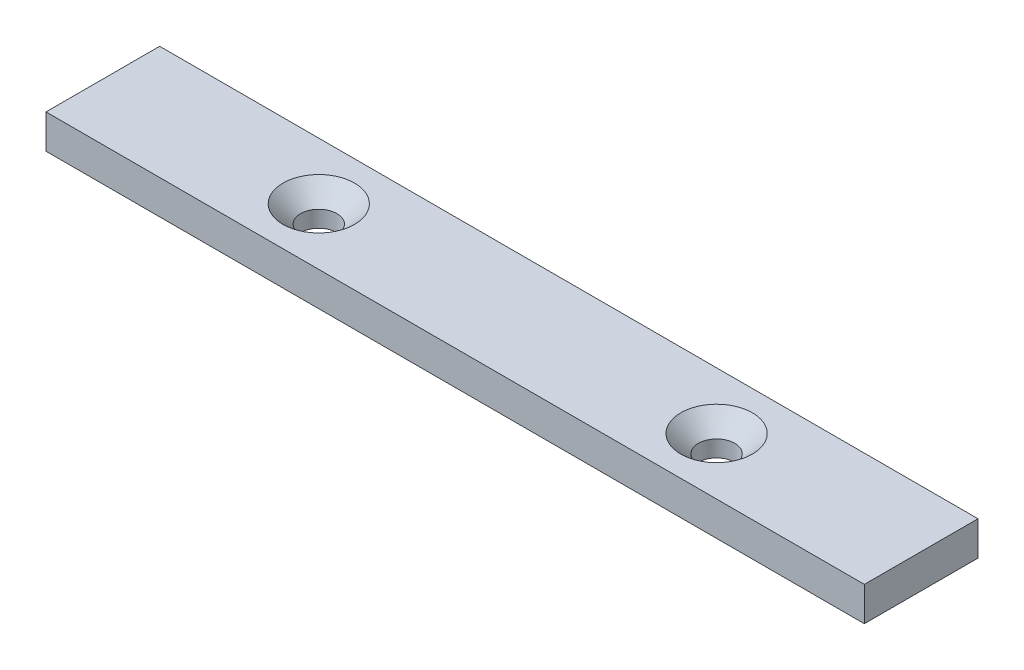
ISO-10303-21;
HEADER;
FILE_DESCRIPTION(('STEP AP214'),'2;1');
FILE_NAME('part.step','',(''),(''),'','','');
FILE_SCHEMA(('AUTOMOTIVE_DESIGN { 1 0 10303 214 1 1 1 1 }'));
ENDSEC;
DATA;
#1=APPLICATION_CONTEXT('core data for automotive mechanical design processes');
#2=APPLICATION_PROTOCOL_DEFINITION('international standard','automotive_design',2000,#1);
#3=PRODUCT_CONTEXT('',#1,'mechanical');
#4=PRODUCT('Part','Part','',(#3));
#5=PRODUCT_RELATED_PRODUCT_CATEGORY('part','',(#4));
#6=PRODUCT_DEFINITION_FORMATION('','',#4);
#7=PRODUCT_DEFINITION_CONTEXT('part definition',#1,'design');
#8=PRODUCT_DEFINITION('design','',#6,#7);
#9=PRODUCT_DEFINITION_SHAPE('','',#8);
#10=(LENGTH_UNIT() NAMED_UNIT(*) SI_UNIT(.MILLI.,.METRE.));
#11=(NAMED_UNIT(*) PLANE_ANGLE_UNIT() SI_UNIT($,.RADIAN.));
#12=(NAMED_UNIT(*) SI_UNIT($,.STERADIAN.) SOLID_ANGLE_UNIT());
#13=UNCERTAINTY_MEASURE_WITH_UNIT(LENGTH_MEASURE(1.E-05),#10,'distance_accuracy_value','');
#14=(GEOMETRIC_REPRESENTATION_CONTEXT(3) GLOBAL_UNCERTAINTY_ASSIGNED_CONTEXT((#13)) GLOBAL_UNIT_ASSIGNED_CONTEXT((#10,
#11,#12)) REPRESENTATION_CONTEXT('',''));
#15=CARTESIAN_POINT('',(0.,0.,0.));
#16=DIRECTION('',(0.,0.,1.));
#17=DIRECTION('',(1.,0.,0.));
#18=AXIS2_PLACEMENT_3D('',#15,#16,#17);
#19=CARTESIAN_POINT('',(0.,6.,0.));
#20=DIRECTION('',(0.,-1.,0.));
#21=DIRECTION('',(0.,0.,-1.));
#22=AXIS2_PLACEMENT_3D('',#19,#20,#21);
#23=PLANE('',#22);
#24=CARTESIAN_POINT('',(36.,6.,0.));
#25=DIRECTION('',(0.,1.,0.));
#26=DIRECTION('',(0.,0.,1.));
#27=AXIS2_PLACEMENT_3D('',#24,#25,#26);
#28=CIRCLE('',#27,6.3);
#29=CARTESIAN_POINT('',(36.,6.,6.3));
#30=VERTEX_POINT('',#29);
#31=EDGE_CURVE('E129',#30,#30,#28,.T.);
#32=ORIENTED_EDGE('',*,*,#31,.F.);
#33=EDGE_LOOP('',(#32));
#34=FACE_BOUND('',#33,.T.);
#35=DIRECTION('',(0.,0.,-1.));
#36=VECTOR('',#35,1.);
#37=CARTESIAN_POINT('',(72.,6.,10.));
#38=LINE('',#37,#36);
#39=CARTESIAN_POINT('',(72.,6.,10.));
#40=VERTEX_POINT('',#39);
#41=CARTESIAN_POINT('',(72.,6.,-10.));
#42=VERTEX_POINT('',#41);
#43=EDGE_CURVE('E89',#40,#42,#38,.T.);
#44=ORIENTED_EDGE('',*,*,#43,.T.);
#45=DIRECTION('',(-1.,0.,0.));
#46=VECTOR('',#45,1.);
#47=CARTESIAN_POINT('',(-72.,6.,-10.));
#48=LINE('',#47,#46);
#49=CARTESIAN_POINT('',(-72.,6.,-10.));
#50=VERTEX_POINT('',#49);
#51=EDGE_CURVE('E84',#42,#50,#48,.T.);
#52=ORIENTED_EDGE('',*,*,#51,.T.);
#53=DIRECTION('',(0.,0.,1.));
#54=VECTOR('',#53,1.);
#55=CARTESIAN_POINT('',(-72.,6.,10.));
#56=LINE('',#55,#54);
#57=CARTESIAN_POINT('',(-72.,6.,10.));
#58=VERTEX_POINT('',#57);
#59=EDGE_CURVE('E87',#50,#58,#56,.T.);
#60=ORIENTED_EDGE('',*,*,#59,.T.);
#61=DIRECTION('',(1.,0.,0.));
#62=VECTOR('',#61,1.);
#63=CARTESIAN_POINT('',(-72.,6.,10.));
#64=LINE('',#63,#62);
#65=EDGE_CURVE('E54',#58,#40,#64,.T.);
#66=ORIENTED_EDGE('',*,*,#65,.T.);
#67=EDGE_LOOP('',(#44,#52,#60,#66));
#68=FACE_BOUND('',#67,.T.);
#69=CARTESIAN_POINT('',(-34.,6.,0.));
#70=DIRECTION('',(0.,1.,0.));
#71=DIRECTION('',(0.,0.,1.));
#72=AXIS2_PLACEMENT_3D('',#69,#70,#71);
#73=CIRCLE('',#72,6.3);
#74=CARTESIAN_POINT('',(-34.,6.,6.3));
#75=VERTEX_POINT('',#74);
#76=EDGE_CURVE('E120',#75,#75,#73,.T.);
#77=ORIENTED_EDGE('',*,*,#76,.F.);
#78=EDGE_LOOP('',(#77));
#79=FACE_BOUND('',#78,.T.);
#80=ADVANCED_FACE('F37',(#34,#68,#79),#23,.F.);
#81=CARTESIAN_POINT('',(72.,6.,10.));
#82=DIRECTION('',(-1.,0.,0.));
#83=DIRECTION('',(0.,0.,1.));
#84=AXIS2_PLACEMENT_3D('',#81,#82,#83);
#85=PLANE('',#84);
#86=DIRECTION('',(0.,0.,-1.));
#87=VECTOR('',#86,1.);
#88=CARTESIAN_POINT('',(72.,0.,10.));
#89=LINE('',#88,#87);
#90=CARTESIAN_POINT('',(72.,0.,10.));
#91=VERTEX_POINT('',#90);
#92=CARTESIAN_POINT('',(72.,0.,-10.));
#93=VERTEX_POINT('',#92);
#94=EDGE_CURVE('E101',#91,#93,#89,.T.);
#95=ORIENTED_EDGE('',*,*,#94,.T.);
#96=DIRECTION('',(0.,-1.,0.));
#97=VECTOR('',#96,1.);
#98=CARTESIAN_POINT('',(72.,6.,-10.));
#99=LINE('',#98,#97);
#100=EDGE_CURVE('E11',#42,#93,#99,.T.);
#101=ORIENTED_EDGE('',*,*,#100,.F.);
#102=ORIENTED_EDGE('',*,*,#43,.F.);
#103=DIRECTION('',(0.,-1.,0.));
#104=VECTOR('',#103,1.);
#105=CARTESIAN_POINT('',(72.,6.,10.));
#106=LINE('',#105,#104);
#107=EDGE_CURVE('E97',#40,#91,#106,.T.);
#108=ORIENTED_EDGE('',*,*,#107,.T.);
#109=EDGE_LOOP('',(#95,#101,#102,#108));
#110=FACE_BOUND('',#109,.T.);
#111=ADVANCED_FACE('F39',(#110),#85,.F.);
#112=CARTESIAN_POINT('',(-72.,6.,-10.));
#113=DIRECTION('',(0.,0.,1.));
#114=DIRECTION('',(1.,0.,0.));
#115=AXIS2_PLACEMENT_3D('',#112,#113,#114);
#116=PLANE('',#115);
#117=DIRECTION('',(-1.,0.,0.));
#118=VECTOR('',#117,1.);
#119=CARTESIAN_POINT('',(-72.,0.,-10.));
#120=LINE('',#119,#118);
#121=CARTESIAN_POINT('',(-72.,0.,-10.));
#122=VERTEX_POINT('',#121);
#123=EDGE_CURVE('E93',#93,#122,#120,.T.);
#124=ORIENTED_EDGE('',*,*,#123,.T.);
#125=DIRECTION('',(0.,-1.,0.));
#126=VECTOR('',#125,1.);
#127=CARTESIAN_POINT('',(-72.,6.,-10.));
#128=LINE('',#127,#126);
#129=EDGE_CURVE('E46',#50,#122,#128,.T.);
#130=ORIENTED_EDGE('',*,*,#129,.F.);
#131=ORIENTED_EDGE('',*,*,#51,.F.);
#132=ORIENTED_EDGE('',*,*,#100,.T.);
#133=EDGE_LOOP('',(#124,#130,#131,#132));
#134=FACE_BOUND('',#133,.T.);
#135=ADVANCED_FACE('F92',(#134),#116,.F.);
#136=CARTESIAN_POINT('',(-72.,6.,10.));
#137=DIRECTION('',(1.,0.,0.));
#138=DIRECTION('',(0.,0.,-1.));
#139=AXIS2_PLACEMENT_3D('',#136,#137,#138);
#140=PLANE('',#139);
#141=DIRECTION('',(0.,0.,1.));
#142=VECTOR('',#141,1.);
#143=CARTESIAN_POINT('',(-72.,0.,10.));
#144=LINE('',#143,#142);
#145=CARTESIAN_POINT('',(-72.,0.,10.));
#146=VERTEX_POINT('',#145);
#147=EDGE_CURVE('E71',#122,#146,#144,.T.);
#148=ORIENTED_EDGE('',*,*,#147,.T.);
#149=DIRECTION('',(0.,-1.,0.));
#150=VECTOR('',#149,1.);
#151=CARTESIAN_POINT('',(-72.,6.,10.));
#152=LINE('',#151,#150);
#153=EDGE_CURVE('E94',#58,#146,#152,.T.);
#154=ORIENTED_EDGE('',*,*,#153,.F.);
#155=ORIENTED_EDGE('',*,*,#59,.F.);
#156=ORIENTED_EDGE('',*,*,#129,.T.);
#157=EDGE_LOOP('',(#148,#154,#155,#156));
#158=FACE_BOUND('',#157,.T.);
#159=ADVANCED_FACE('F95',(#158),#140,.F.);
#160=CARTESIAN_POINT('',(-72.,6.,10.));
#161=DIRECTION('',(0.,0.,-1.));
#162=DIRECTION('',(-1.,0.,0.));
#163=AXIS2_PLACEMENT_3D('',#160,#161,#162);
#164=PLANE('',#163);
#165=DIRECTION('',(1.,0.,0.));
#166=VECTOR('',#165,1.);
#167=CARTESIAN_POINT('',(-72.,0.,10.));
#168=LINE('',#167,#166);
#169=EDGE_CURVE('E77',#146,#91,#168,.T.);
#170=ORIENTED_EDGE('',*,*,#169,.T.);
#171=ORIENTED_EDGE('',*,*,#107,.F.);
#172=ORIENTED_EDGE('',*,*,#65,.F.);
#173=ORIENTED_EDGE('',*,*,#153,.T.);
#174=EDGE_LOOP('',(#170,#171,#172,#173));
#175=FACE_BOUND('',#174,.T.);
#176=ADVANCED_FACE('F109',(#175),#164,.F.);
#177=CARTESIAN_POINT('',(0.,0.,0.));
#178=DIRECTION('',(0.,-1.,0.));
#179=DIRECTION('',(0.,0.,-1.));
#180=AXIS2_PLACEMENT_3D('',#177,#178,#179);
#181=PLANE('',#180);
#182=CARTESIAN_POINT('',(36.,0.,0.));
#183=DIRECTION('',(0.,-1.,0.));
#184=DIRECTION('',(0.,0.,-1.));
#185=AXIS2_PLACEMENT_3D('',#182,#183,#184);
#186=CIRCLE('',#185,3.2);
#187=CARTESIAN_POINT('',(36.,0.,-3.2));
#188=VERTEX_POINT('',#187);
#189=EDGE_CURVE('E123',#188,#188,#186,.T.);
#190=ORIENTED_EDGE('',*,*,#189,.F.);
#191=EDGE_LOOP('',(#190));
#192=FACE_BOUND('',#191,.T.);
#193=CARTESIAN_POINT('',(-34.,0.,0.));
#194=DIRECTION('',(0.,-1.,0.));
#195=DIRECTION('',(0.,0.,-1.));
#196=AXIS2_PLACEMENT_3D('',#193,#194,#195);
#197=CIRCLE('',#196,3.2);
#198=CARTESIAN_POINT('',(-34.,0.,-3.2));
#199=VERTEX_POINT('',#198);
#200=EDGE_CURVE('E104',#199,#199,#197,.T.);
#201=ORIENTED_EDGE('',*,*,#200,.F.);
#202=EDGE_LOOP('',(#201));
#203=FACE_BOUND('',#202,.T.);
#204=ORIENTED_EDGE('',*,*,#94,.F.);
#205=ORIENTED_EDGE('',*,*,#169,.F.);
#206=ORIENTED_EDGE('',*,*,#147,.F.);
#207=ORIENTED_EDGE('',*,*,#123,.F.);
#208=EDGE_LOOP('',(#204,#205,#206,#207));
#209=FACE_BOUND('',#208,.T.);
#210=ADVANCED_FACE('F112',(#192,#203,#209),#181,.T.);
#211=CARTESIAN_POINT('',(-34.,6.,0.));
#212=DIRECTION('',(0.,1.,0.));
#213=DIRECTION('',(0.,0.,1.));
#214=AXIS2_PLACEMENT_3D('',#211,#212,#213);
#215=CYLINDRICAL_SURFACE('',#214,3.2);
#216=CARTESIAN_POINT('',(-34.,2.9,0.));
#217=DIRECTION('',(0.,1.,0.));
#218=DIRECTION('',(0.,0.,1.));
#219=AXIS2_PLACEMENT_3D('',#216,#217,#218);
#220=CIRCLE('',#219,3.2);
#221=CARTESIAN_POINT('',(-34.,2.9,3.2));
#222=VERTEX_POINT('',#221);
#223=EDGE_CURVE('E117',#222,#222,#220,.T.);
#224=ORIENTED_EDGE('',*,*,#223,.T.);
#225=EDGE_LOOP('',(#224));
#226=FACE_BOUND('',#225,.T.);
#227=ORIENTED_EDGE('',*,*,#200,.T.);
#228=EDGE_LOOP('',(#227));
#229=FACE_BOUND('',#228,.T.);
#230=ADVANCED_FACE('F142',(#226,#229),#215,.F.);
#231=CARTESIAN_POINT('',(-34.,6.,0.));
#232=DIRECTION('',(0.,1.,0.));
#233=DIRECTION('',(0.,0.,1.));
#234=AXIS2_PLACEMENT_3D('',#231,#232,#233);
#235=CONICAL_SURFACE('',#234,6.3,0.785398163397448);
#236=ORIENTED_EDGE('',*,*,#223,.F.);
#237=EDGE_LOOP('',(#236));
#238=FACE_BOUND('',#237,.T.);
#239=ORIENTED_EDGE('',*,*,#76,.T.);
#240=EDGE_LOOP('',(#239));
#241=FACE_BOUND('',#240,.T.);
#242=ADVANCED_FACE('F173',(#238,#241),#235,.F.);
#243=CARTESIAN_POINT('',(36.,6.,0.));
#244=DIRECTION('',(0.,1.,0.));
#245=DIRECTION('',(0.,0.,1.));
#246=AXIS2_PLACEMENT_3D('',#243,#244,#245);
#247=CYLINDRICAL_SURFACE('',#246,3.2);
#248=CARTESIAN_POINT('',(36.,2.9,0.));
#249=DIRECTION('',(0.,1.,0.));
#250=DIRECTION('',(0.,0.,1.));
#251=AXIS2_PLACEMENT_3D('',#248,#249,#250);
#252=CIRCLE('',#251,3.2);
#253=CARTESIAN_POINT('',(36.,2.9,3.2));
#254=VERTEX_POINT('',#253);
#255=EDGE_CURVE('E126',#254,#254,#252,.T.);
#256=ORIENTED_EDGE('',*,*,#255,.T.);
#257=EDGE_LOOP('',(#256));
#258=FACE_BOUND('',#257,.T.);
#259=ORIENTED_EDGE('',*,*,#189,.T.);
#260=EDGE_LOOP('',(#259));
#261=FACE_BOUND('',#260,.T.);
#262=ADVANCED_FACE('F180',(#258,#261),#247,.F.);
#263=CARTESIAN_POINT('',(36.,6.,0.));
#264=DIRECTION('',(0.,1.,0.));
#265=DIRECTION('',(0.,0.,1.));
#266=AXIS2_PLACEMENT_3D('',#263,#264,#265);
#267=CONICAL_SURFACE('',#266,6.3,0.785398163397448);
#268=ORIENTED_EDGE('',*,*,#255,.F.);
#269=EDGE_LOOP('',(#268));
#270=FACE_BOUND('',#269,.T.);
#271=ORIENTED_EDGE('',*,*,#31,.T.);
#272=EDGE_LOOP('',(#271));
#273=FACE_BOUND('',#272,.T.);
#274=ADVANCED_FACE('F133',(#270,#273),#267,.F.);
#275=CLOSED_SHELL('',(#80,#111,#135,#159,#176,#210,#230,#242,#262,#274));
#276=MANIFOLD_SOLID_BREP('B2',#275);
#277=ADVANCED_BREP_SHAPE_REPRESENTATION('',(#18,#276),#14);
#278=SHAPE_DEFINITION_REPRESENTATION(#9,#277);
ENDSEC;
END-ISO-10303-21;
